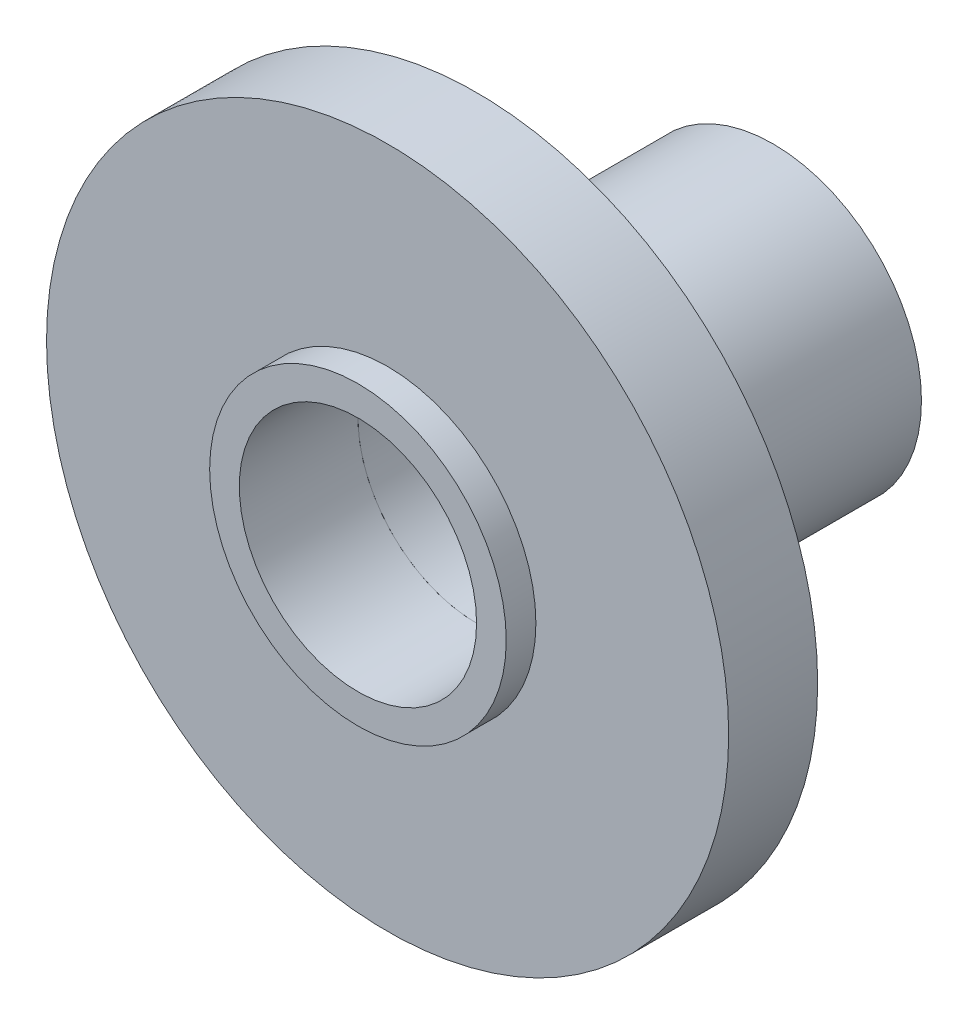
ISO-10303-21;
HEADER;
FILE_DESCRIPTION(('STEP AP214'),'2;1');
FILE_NAME('part.step','',(''),(''),'','','');
FILE_SCHEMA(('AUTOMOTIVE_DESIGN { 1 0 10303 214 1 1 1 1 }'));
ENDSEC;
DATA;
#1=APPLICATION_CONTEXT('core data for automotive mechanical design processes');
#2=APPLICATION_PROTOCOL_DEFINITION('international standard','automotive_design',2000,#1);
#3=PRODUCT_CONTEXT('',#1,'mechanical');
#4=PRODUCT('Part','Part','',(#3));
#5=PRODUCT_RELATED_PRODUCT_CATEGORY('part','',(#4));
#6=PRODUCT_DEFINITION_FORMATION('','',#4);
#7=PRODUCT_DEFINITION_CONTEXT('part definition',#1,'design');
#8=PRODUCT_DEFINITION('design','',#6,#7);
#9=PRODUCT_DEFINITION_SHAPE('','',#8);
#10=(LENGTH_UNIT() NAMED_UNIT(*) SI_UNIT(.MILLI.,.METRE.));
#11=(NAMED_UNIT(*) PLANE_ANGLE_UNIT() SI_UNIT($,.RADIAN.));
#12=(NAMED_UNIT(*) SI_UNIT($,.STERADIAN.) SOLID_ANGLE_UNIT());
#13=UNCERTAINTY_MEASURE_WITH_UNIT(LENGTH_MEASURE(1.E-05),#10,'distance_accuracy_value','');
#14=(GEOMETRIC_REPRESENTATION_CONTEXT(3) GLOBAL_UNCERTAINTY_ASSIGNED_CONTEXT((#13)) GLOBAL_UNIT_ASSIGNED_CONTEXT((#10,
#11,#12)) REPRESENTATION_CONTEXT('',''));
#15=CARTESIAN_POINT('',(0.,0.,0.));
#16=DIRECTION('',(0.,0.,1.));
#17=DIRECTION('',(1.,0.,0.));
#18=AXIS2_PLACEMENT_3D('',#15,#16,#17);
#19=CARTESIAN_POINT('',(0.,0.,-13.));
#20=DIRECTION('',(0.,0.,-1.));
#21=DIRECTION('',(-1.,0.,0.));
#22=AXIS2_PLACEMENT_3D('',#19,#20,#21);
#23=PLANE('',#22);
#24=CARTESIAN_POINT('',(0.,0.,-13.));
#25=DIRECTION('',(0.,0.,-1.));
#26=DIRECTION('',(-1.,0.,0.));
#27=AXIS2_PLACEMENT_3D('',#24,#25,#26);
#28=CIRCLE('',#27,5.);
#29=CARTESIAN_POINT('',(-5.,0.,-13.));
#30=VERTEX_POINT('',#29);
#31=EDGE_CURVE('E11',#30,#30,#28,.T.);
#32=ORIENTED_EDGE('',*,*,#31,.T.);
#33=EDGE_LOOP('',(#32));
#34=FACE_BOUND('',#33,.T.);
#35=CARTESIAN_POINT('',(0.,0.,-13.));
#36=DIRECTION('',(0.,0.,-1.));
#37=DIRECTION('',(-1.,0.,0.));
#38=AXIS2_PLACEMENT_3D('',#35,#36,#37);
#39=CIRCLE('',#38,4.);
#40=CARTESIAN_POINT('',(-4.,0.,-13.));
#41=VERTEX_POINT('',#40);
#42=EDGE_CURVE('E58',#41,#41,#39,.T.);
#43=ORIENTED_EDGE('',*,*,#42,.F.);
#44=EDGE_LOOP('',(#43));
#45=FACE_BOUND('',#44,.T.);
#46=ADVANCED_FACE('F47',(#34,#45),#23,.T.);
#47=CARTESIAN_POINT('',(0.,0.,-3.));
#48=DIRECTION('',(0.,0.,-1.));
#49=DIRECTION('',(-1.,0.,0.));
#50=AXIS2_PLACEMENT_3D('',#47,#48,#49);
#51=PLANE('',#50);
#52=CARTESIAN_POINT('',(0.,0.,-3.));
#53=DIRECTION('',(0.,0.,-1.));
#54=DIRECTION('',(-1.,0.,0.));
#55=AXIS2_PLACEMENT_3D('',#52,#53,#54);
#56=CIRCLE('',#55,5.);
#57=CARTESIAN_POINT('',(-5.,0.,-3.));
#58=VERTEX_POINT('',#57);
#59=EDGE_CURVE('E51',#58,#58,#56,.T.);
#60=ORIENTED_EDGE('',*,*,#59,.F.);
#61=EDGE_LOOP('',(#60));
#62=FACE_BOUND('',#61,.T.);
#63=CARTESIAN_POINT('',(0.,0.,-3.));
#64=DIRECTION('',(0.,0.,-1.));
#65=DIRECTION('',(-1.,0.,0.));
#66=AXIS2_PLACEMENT_3D('',#63,#64,#65);
#67=CIRCLE('',#66,4.);
#68=CARTESIAN_POINT('',(-4.,0.,-3.));
#69=VERTEX_POINT('',#68);
#70=EDGE_CURVE('E60',#69,#69,#67,.T.);
#71=ORIENTED_EDGE('',*,*,#70,.T.);
#72=EDGE_LOOP('',(#71));
#73=FACE_BOUND('',#72,.T.);
#74=ADVANCED_FACE('F70',(#62,#73),#51,.F.);
#75=CARTESIAN_POINT('',(0.,0.,-13.));
#76=DIRECTION('',(0.,0.,1.));
#77=DIRECTION('',(1.,0.,0.));
#78=AXIS2_PLACEMENT_3D('',#75,#76,#77);
#79=CYLINDRICAL_SURFACE('',#78,5.);
#80=ORIENTED_EDGE('',*,*,#31,.F.);
#81=EDGE_LOOP('',(#80));
#82=FACE_BOUND('',#81,.T.);
#83=ORIENTED_EDGE('',*,*,#59,.T.);
#84=EDGE_LOOP('',(#83));
#85=FACE_BOUND('',#84,.T.);
#86=ADVANCED_FACE('F49',(#82,#85),#79,.T.);
#87=CARTESIAN_POINT('',(0.,0.,-13.));
#88=DIRECTION('',(0.,0.,1.));
#89=DIRECTION('',(1.,0.,0.));
#90=AXIS2_PLACEMENT_3D('',#87,#88,#89);
#91=CYLINDRICAL_SURFACE('',#90,4.);
#92=ORIENTED_EDGE('',*,*,#42,.T.);
#93=EDGE_LOOP('',(#92));
#94=FACE_BOUND('',#93,.T.);
#95=ORIENTED_EDGE('',*,*,#70,.F.);
#96=EDGE_LOOP('',(#95));
#97=FACE_BOUND('',#96,.T.);
#98=ADVANCED_FACE('F66',(#94,#97),#91,.F.);
#99=CLOSED_SHELL('',(#46,#74,#86,#98));
#100=MANIFOLD_SOLID_BREP('B2',#99);
#101=CARTESIAN_POINT('',(0.,0.,1.));
#102=DIRECTION('',(0.,0.,1.));
#103=DIRECTION('',(1.,0.,0.));
#104=AXIS2_PLACEMENT_3D('',#101,#102,#103);
#105=PLANE('',#104);
#106=CARTESIAN_POINT('',(0.,0.,1.));
#107=DIRECTION('',(0.,0.,1.));
#108=DIRECTION('',(1.,0.,0.));
#109=AXIS2_PLACEMENT_3D('',#106,#107,#108);
#110=CIRCLE('',#109,5.);
#111=CARTESIAN_POINT('',(5.,0.,1.));
#112=VERTEX_POINT('',#111);
#113=EDGE_CURVE('E46',#112,#112,#110,.T.);
#114=ORIENTED_EDGE('',*,*,#113,.T.);
#115=EDGE_LOOP('',(#114));
#116=FACE_BOUND('',#115,.T.);
#117=CARTESIAN_POINT('',(0.,0.,1.));
#118=DIRECTION('',(0.,0.,1.));
#119=DIRECTION('',(1.,0.,0.));
#120=AXIS2_PLACEMENT_3D('',#117,#118,#119);
#121=CIRCLE('',#120,4.);
#122=CARTESIAN_POINT('',(4.,0.,1.));
#123=VERTEX_POINT('',#122);
#124=EDGE_CURVE('E118',#123,#123,#121,.T.);
#125=ORIENTED_EDGE('',*,*,#124,.F.);
#126=EDGE_LOOP('',(#125));
#127=FACE_BOUND('',#126,.T.);
#128=ADVANCED_FACE('F109',(#116,#127),#105,.T.);
#129=CARTESIAN_POINT('',(0.,0.,1.));
#130=DIRECTION('',(0.,0.,-1.));
#131=DIRECTION('',(-1.,0.,0.));
#132=AXIS2_PLACEMENT_3D('',#129,#130,#131);
#133=CYLINDRICAL_SURFACE('',#132,5.);
#134=ORIENTED_EDGE('',*,*,#113,.F.);
#135=EDGE_LOOP('',(#134));
#136=FACE_BOUND('',#135,.T.);
#137=CARTESIAN_POINT('',(0.,0.,0.));
#138=DIRECTION('',(0.,0.,1.));
#139=DIRECTION('',(1.,0.,0.));
#140=AXIS2_PLACEMENT_3D('',#137,#138,#139);
#141=CIRCLE('',#140,5.);
#142=CARTESIAN_POINT('',(5.,0.,0.));
#143=VERTEX_POINT('',#142);
#144=EDGE_CURVE('E113',#143,#143,#141,.T.);
#145=ORIENTED_EDGE('',*,*,#144,.T.);
#146=EDGE_LOOP('',(#145));
#147=FACE_BOUND('',#146,.T.);
#148=ADVANCED_FACE('F111',(#136,#147),#133,.T.);
#149=CARTESIAN_POINT('',(0.,0.,1.));
#150=DIRECTION('',(0.,0.,-1.));
#151=DIRECTION('',(-1.,0.,0.));
#152=AXIS2_PLACEMENT_3D('',#149,#150,#151);
#153=CYLINDRICAL_SURFACE('',#152,4.);
#154=ORIENTED_EDGE('',*,*,#124,.T.);
#155=EDGE_LOOP('',(#154));
#156=FACE_BOUND('',#155,.T.);
#157=CARTESIAN_POINT('',(0.,0.,-3.));
#158=DIRECTION('',(0.,0.,1.));
#159=DIRECTION('',(1.,0.,0.));
#160=AXIS2_PLACEMENT_3D('',#157,#158,#159);
#161=CIRCLE('',#160,4.);
#162=CARTESIAN_POINT('',(4.,0.,-3.));
#163=VERTEX_POINT('',#162);
#164=EDGE_CURVE('E130',#163,#163,#161,.T.);
#165=ORIENTED_EDGE('',*,*,#164,.F.);
#166=EDGE_LOOP('',(#165));
#167=FACE_BOUND('',#166,.T.);
#168=ADVANCED_FACE('F141',(#156,#167),#153,.F.);
#169=CARTESIAN_POINT('',(0.,0.,-3.));
#170=DIRECTION('',(0.,0.,1.));
#171=DIRECTION('',(1.,0.,0.));
#172=AXIS2_PLACEMENT_3D('',#169,#170,#171);
#173=CYLINDRICAL_SURFACE('',#172,11.5);
#174=CARTESIAN_POINT('',(0.,0.,-3.));
#175=DIRECTION('',(0.,0.,1.));
#176=DIRECTION('',(1.,0.,0.));
#177=AXIS2_PLACEMENT_3D('',#174,#175,#176);
#178=CIRCLE('',#177,11.5);
#179=CARTESIAN_POINT('',(11.5,0.,-3.));
#180=VERTEX_POINT('',#179);
#181=EDGE_CURVE('E129',#180,#180,#178,.T.);
#182=ORIENTED_EDGE('',*,*,#181,.T.);
#183=EDGE_LOOP('',(#182));
#184=FACE_BOUND('',#183,.T.);
#185=CARTESIAN_POINT('',(0.,0.,0.));
#186=DIRECTION('',(0.,0.,1.));
#187=DIRECTION('',(1.,0.,0.));
#188=AXIS2_PLACEMENT_3D('',#185,#186,#187);
#189=CIRCLE('',#188,11.5);
#190=CARTESIAN_POINT('',(11.5,0.,0.));
#191=VERTEX_POINT('',#190);
#192=EDGE_CURVE('E125',#191,#191,#189,.T.);
#193=ORIENTED_EDGE('',*,*,#192,.F.);
#194=EDGE_LOOP('',(#193));
#195=FACE_BOUND('',#194,.T.);
#196=ADVANCED_FACE('F143',(#184,#195),#173,.T.);
#197=CARTESIAN_POINT('',(0.,0.,-3.));
#198=DIRECTION('',(0.,0.,1.));
#199=DIRECTION('',(1.,0.,0.));
#200=AXIS2_PLACEMENT_3D('',#197,#198,#199);
#201=PLANE('',#200);
#202=ORIENTED_EDGE('',*,*,#164,.T.);
#203=EDGE_LOOP('',(#202));
#204=FACE_BOUND('',#203,.T.);
#205=ORIENTED_EDGE('',*,*,#181,.F.);
#206=EDGE_LOOP('',(#205));
#207=FACE_BOUND('',#206,.T.);
#208=ADVANCED_FACE('F138',(#204,#207),#201,.F.);
#209=CARTESIAN_POINT('',(0.,0.,0.));
#210=DIRECTION('',(0.,0.,1.));
#211=DIRECTION('',(1.,0.,0.));
#212=AXIS2_PLACEMENT_3D('',#209,#210,#211);
#213=PLANE('',#212);
#214=ORIENTED_EDGE('',*,*,#144,.F.);
#215=EDGE_LOOP('',(#214));
#216=FACE_BOUND('',#215,.T.);
#217=ORIENTED_EDGE('',*,*,#192,.T.);
#218=EDGE_LOOP('',(#217));
#219=FACE_BOUND('',#218,.T.);
#220=ADVANCED_FACE('F182',(#216,#219),#213,.T.);
#221=CLOSED_SHELL('',(#128,#148,#168,#196,#208,#220));
#222=MANIFOLD_SOLID_BREP('B6',#221);
#223=ADVANCED_BREP_SHAPE_REPRESENTATION('',(#18,#100,#222),#14);
#224=SHAPE_DEFINITION_REPRESENTATION(#9,#223);
ENDSEC;
END-ISO-10303-21;
